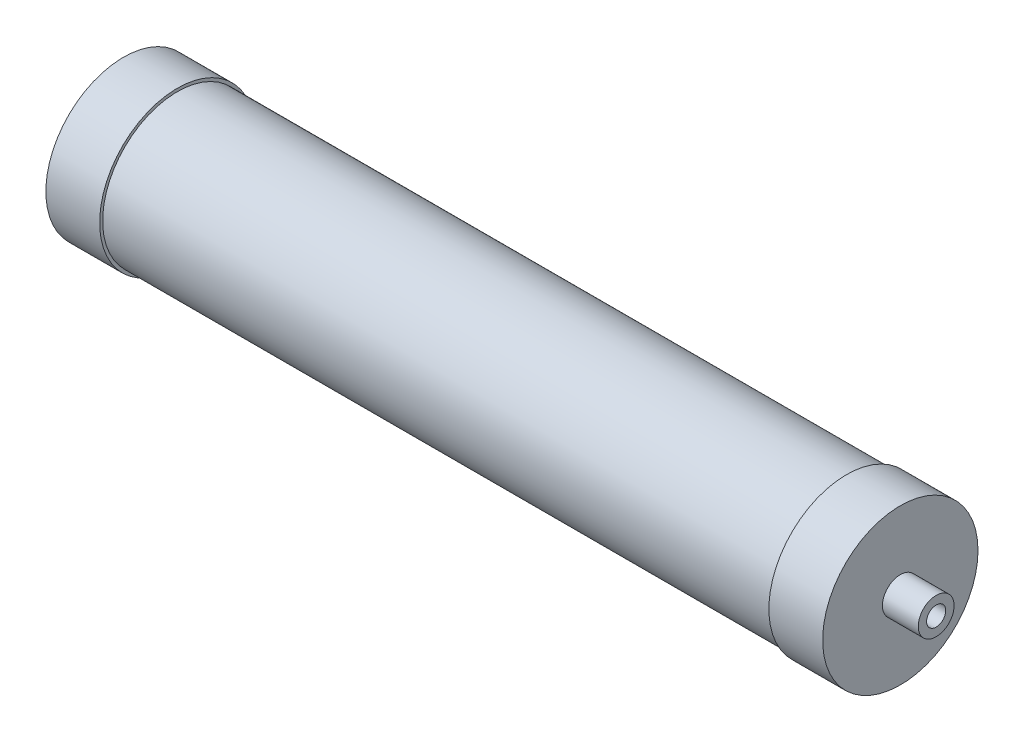
ISO-10303-21;
HEADER;
FILE_DESCRIPTION(('STEP AP214'),'2;1');
FILE_NAME('part.step','',(''),(''),'','','');
FILE_SCHEMA(('AUTOMOTIVE_DESIGN { 1 0 10303 214 1 1 1 1 }'));
ENDSEC;
DATA;
#1=APPLICATION_CONTEXT('core data for automotive mechanical design processes');
#2=APPLICATION_PROTOCOL_DEFINITION('international standard','automotive_design',2000,#1);
#3=PRODUCT_CONTEXT('',#1,'mechanical');
#4=PRODUCT('Part','Part','',(#3));
#5=PRODUCT_RELATED_PRODUCT_CATEGORY('part','',(#4));
#6=PRODUCT_DEFINITION_FORMATION('','',#4);
#7=PRODUCT_DEFINITION_CONTEXT('part definition',#1,'design');
#8=PRODUCT_DEFINITION('design','',#6,#7);
#9=PRODUCT_DEFINITION_SHAPE('','',#8);
#10=(LENGTH_UNIT() NAMED_UNIT(*) SI_UNIT(.MILLI.,.METRE.));
#11=(NAMED_UNIT(*) PLANE_ANGLE_UNIT() SI_UNIT($,.RADIAN.));
#12=(NAMED_UNIT(*) SI_UNIT($,.STERADIAN.) SOLID_ANGLE_UNIT());
#13=UNCERTAINTY_MEASURE_WITH_UNIT(LENGTH_MEASURE(1.E-05),#10,'distance_accuracy_value','');
#14=(GEOMETRIC_REPRESENTATION_CONTEXT(3) GLOBAL_UNCERTAINTY_ASSIGNED_CONTEXT((#13)) GLOBAL_UNIT_ASSIGNED_CONTEXT((#10,
#11,#12)) REPRESENTATION_CONTEXT('',''));
#15=CARTESIAN_POINT('',(0.,0.,0.));
#16=DIRECTION('',(0.,0.,1.));
#17=DIRECTION('',(1.,0.,0.));
#18=AXIS2_PLACEMENT_3D('',#15,#16,#17);
#19=CARTESIAN_POINT('',(130.,0.,0.));
#20=DIRECTION('',(-1.,0.,0.));
#21=DIRECTION('',(0.,0.,1.));
#22=AXIS2_PLACEMENT_3D('',#19,#20,#21);
#23=CYLINDRICAL_SURFACE('',#22,25.);
#24=CARTESIAN_POINT('',(-112.,0.,0.));
#25=DIRECTION('',(1.,0.,0.));
#26=DIRECTION('',(0.,0.,-1.));
#27=AXIS2_PLACEMENT_3D('',#24,#25,#26);
#28=CIRCLE('',#27,25.);
#29=CARTESIAN_POINT('',(-112.,0.,-25.));
#30=VERTEX_POINT('',#29);
#31=EDGE_CURVE('E58',#30,#30,#28,.T.);
#32=ORIENTED_EDGE('',*,*,#31,.T.);
#33=EDGE_LOOP('',(#32));
#34=FACE_BOUND('',#33,.T.);
#35=CARTESIAN_POINT('',(112.,0.,0.));
#36=DIRECTION('',(1.,0.,0.));
#37=DIRECTION('',(0.,0.,-1.));
#38=AXIS2_PLACEMENT_3D('',#35,#36,#37);
#39=CIRCLE('',#38,25.);
#40=CARTESIAN_POINT('',(112.,0.,-25.));
#41=VERTEX_POINT('',#40);
#42=EDGE_CURVE('E49',#41,#41,#39,.T.);
#43=ORIENTED_EDGE('',*,*,#42,.F.);
#44=EDGE_LOOP('',(#43));
#45=FACE_BOUND('',#44,.T.);
#46=ADVANCED_FACE('F50',(#34,#45),#23,.T.);
#47=CARTESIAN_POINT('',(-112.,0.,0.));
#48=DIRECTION('',(-1.,0.,0.));
#49=DIRECTION('',(0.,0.,1.));
#50=AXIS2_PLACEMENT_3D('',#47,#48,#49);
#51=CYLINDRICAL_SURFACE('',#50,26.);
#52=CARTESIAN_POINT('',(-112.,0.,0.));
#53=DIRECTION('',(1.,0.,0.));
#54=DIRECTION('',(0.,0.,-1.));
#55=AXIS2_PLACEMENT_3D('',#52,#53,#54);
#56=CIRCLE('',#55,26.);
#57=CARTESIAN_POINT('',(-112.,0.,-26.));
#58=VERTEX_POINT('',#57);
#59=EDGE_CURVE('E89',#58,#58,#56,.T.);
#60=ORIENTED_EDGE('',*,*,#59,.F.);
#61=EDGE_LOOP('',(#60));
#62=FACE_BOUND('',#61,.T.);
#63=CARTESIAN_POINT('',(-130.,0.,0.));
#64=DIRECTION('',(1.,0.,0.));
#65=DIRECTION('',(0.,0.,-1.));
#66=AXIS2_PLACEMENT_3D('',#63,#64,#65);
#67=CIRCLE('',#66,26.);
#68=CARTESIAN_POINT('',(-130.,0.,-26.));
#69=VERTEX_POINT('',#68);
#70=EDGE_CURVE('E88',#69,#69,#67,.T.);
#71=ORIENTED_EDGE('',*,*,#70,.T.);
#72=EDGE_LOOP('',(#71));
#73=FACE_BOUND('',#72,.T.);
#74=ADVANCED_FACE('F106',(#62,#73),#51,.T.);
#75=CARTESIAN_POINT('',(-112.,0.,0.));
#76=DIRECTION('',(1.,0.,0.));
#77=DIRECTION('',(0.,0.,-1.));
#78=AXIS2_PLACEMENT_3D('',#75,#76,#77);
#79=PLANE('',#78);
#80=ORIENTED_EDGE('',*,*,#31,.F.);
#81=EDGE_LOOP('',(#80));
#82=FACE_BOUND('',#81,.T.);
#83=ORIENTED_EDGE('',*,*,#59,.T.);
#84=EDGE_LOOP('',(#83));
#85=FACE_BOUND('',#84,.T.);
#86=ADVANCED_FACE('F105',(#82,#85),#79,.T.);
#87=CARTESIAN_POINT('',(-130.,0.,0.));
#88=DIRECTION('',(1.,0.,0.));
#89=DIRECTION('',(0.,0.,-1.));
#90=AXIS2_PLACEMENT_3D('',#87,#88,#89);
#91=PLANE('',#90);
#92=CARTESIAN_POINT('',(-130.,0.,0.));
#93=DIRECTION('',(1.,0.,0.));
#94=DIRECTION('',(0.,0.,-1.));
#95=AXIS2_PLACEMENT_3D('',#92,#93,#94);
#96=CIRCLE('',#95,6.);
#97=CARTESIAN_POINT('',(-130.,0.,-6.));
#98=VERTEX_POINT('',#97);
#99=EDGE_CURVE('E74',#98,#98,#96,.T.);
#100=ORIENTED_EDGE('',*,*,#99,.T.);
#101=EDGE_LOOP('',(#100));
#102=FACE_BOUND('',#101,.T.);
#103=ORIENTED_EDGE('',*,*,#70,.F.);
#104=EDGE_LOOP('',(#103));
#105=FACE_BOUND('',#104,.T.);
#106=ADVANCED_FACE('F104',(#102,#105),#91,.F.);
#107=CARTESIAN_POINT('',(130.,0.,0.));
#108=DIRECTION('',(-1.,0.,0.));
#109=DIRECTION('',(0.,0.,1.));
#110=AXIS2_PLACEMENT_3D('',#107,#108,#109);
#111=CYLINDRICAL_SURFACE('',#110,26.);
#112=CARTESIAN_POINT('',(130.,0.,0.));
#113=DIRECTION('',(1.,0.,0.));
#114=DIRECTION('',(0.,0.,-1.));
#115=AXIS2_PLACEMENT_3D('',#112,#113,#114);
#116=CIRCLE('',#115,26.);
#117=CARTESIAN_POINT('',(130.,0.,-26.));
#118=VERTEX_POINT('',#117);
#119=EDGE_CURVE('E85',#118,#118,#116,.T.);
#120=ORIENTED_EDGE('',*,*,#119,.F.);
#121=EDGE_LOOP('',(#120));
#122=FACE_BOUND('',#121,.T.);
#123=CARTESIAN_POINT('',(112.,0.,0.));
#124=DIRECTION('',(1.,0.,0.));
#125=DIRECTION('',(0.,0.,-1.));
#126=AXIS2_PLACEMENT_3D('',#123,#124,#125);
#127=CIRCLE('',#126,26.);
#128=CARTESIAN_POINT('',(112.,0.,-26.));
#129=VERTEX_POINT('',#128);
#130=EDGE_CURVE('E79',#129,#129,#127,.T.);
#131=ORIENTED_EDGE('',*,*,#130,.T.);
#132=EDGE_LOOP('',(#131));
#133=FACE_BOUND('',#132,.T.);
#134=ADVANCED_FACE('F116',(#122,#133),#111,.T.);
#135=CARTESIAN_POINT('',(112.,0.,0.));
#136=DIRECTION('',(1.,0.,0.));
#137=DIRECTION('',(0.,0.,-1.));
#138=AXIS2_PLACEMENT_3D('',#135,#136,#137);
#139=PLANE('',#138);
#140=ORIENTED_EDGE('',*,*,#42,.T.);
#141=EDGE_LOOP('',(#140));
#142=FACE_BOUND('',#141,.T.);
#143=ORIENTED_EDGE('',*,*,#130,.F.);
#144=EDGE_LOOP('',(#143));
#145=FACE_BOUND('',#144,.T.);
#146=ADVANCED_FACE('F123',(#142,#145),#139,.F.);
#147=CARTESIAN_POINT('',(130.,0.,0.));
#148=DIRECTION('',(1.,0.,0.));
#149=DIRECTION('',(0.,0.,-1.));
#150=AXIS2_PLACEMENT_3D('',#147,#148,#149);
#151=PLANE('',#150);
#152=CARTESIAN_POINT('',(130.,0.,0.));
#153=DIRECTION('',(1.,0.,0.));
#154=DIRECTION('',(0.,0.,-1.));
#155=AXIS2_PLACEMENT_3D('',#152,#153,#154);
#156=CIRCLE('',#155,6.);
#157=CARTESIAN_POINT('',(130.,0.,-6.));
#158=VERTEX_POINT('',#157);
#159=EDGE_CURVE('E10',#158,#158,#156,.T.);
#160=ORIENTED_EDGE('',*,*,#159,.F.);
#161=EDGE_LOOP('',(#160));
#162=FACE_BOUND('',#161,.T.);
#163=ORIENTED_EDGE('',*,*,#119,.T.);
#164=EDGE_LOOP('',(#163));
#165=FACE_BOUND('',#164,.T.);
#166=ADVANCED_FACE('F147',(#162,#165),#151,.T.);
#167=CARTESIAN_POINT('',(-130.,0.,0.));
#168=DIRECTION('',(-1.,0.,0.));
#169=DIRECTION('',(0.,0.,1.));
#170=AXIS2_PLACEMENT_3D('',#167,#168,#169);
#171=CYLINDRICAL_SURFACE('',#170,6.);
#172=ORIENTED_EDGE('',*,*,#99,.F.);
#173=EDGE_LOOP('',(#172));
#174=FACE_BOUND('',#173,.T.);
#175=CARTESIAN_POINT('',(-142.,0.,0.));
#176=DIRECTION('',(1.,0.,0.));
#177=DIRECTION('',(0.,0.,-1.));
#178=AXIS2_PLACEMENT_3D('',#175,#176,#177);
#179=CIRCLE('',#178,6.);
#180=CARTESIAN_POINT('',(-142.,0.,-6.));
#181=VERTEX_POINT('',#180);
#182=EDGE_CURVE('E69',#181,#181,#179,.T.);
#183=ORIENTED_EDGE('',*,*,#182,.T.);
#184=EDGE_LOOP('',(#183));
#185=FACE_BOUND('',#184,.T.);
#186=ADVANCED_FACE('F189',(#174,#185),#171,.T.);
#187=CARTESIAN_POINT('',(-142.,0.,0.));
#188=DIRECTION('',(1.,0.,0.));
#189=DIRECTION('',(0.,0.,-1.));
#190=AXIS2_PLACEMENT_3D('',#187,#188,#189);
#191=PLANE('',#190);
#192=CARTESIAN_POINT('',(-142.,0.,0.));
#193=DIRECTION('',(1.,0.,0.));
#194=DIRECTION('',(0.,0.,-1.));
#195=AXIS2_PLACEMENT_3D('',#192,#193,#194);
#196=CIRCLE('',#195,3.2);
#197=CARTESIAN_POINT('',(-142.,0.,-3.2));
#198=VERTEX_POINT('',#197);
#199=EDGE_CURVE('E66',#198,#198,#196,.T.);
#200=ORIENTED_EDGE('',*,*,#199,.T.);
#201=EDGE_LOOP('',(#200));
#202=FACE_BOUND('',#201,.T.);
#203=ORIENTED_EDGE('',*,*,#182,.F.);
#204=EDGE_LOOP('',(#203));
#205=FACE_BOUND('',#204,.T.);
#206=ADVANCED_FACE('F203',(#202,#205),#191,.F.);
#207=CARTESIAN_POINT('',(-132.,0.,0.));
#208=DIRECTION('',(-1.,0.,0.));
#209=DIRECTION('',(0.,0.,1.));
#210=AXIS2_PLACEMENT_3D('',#207,#208,#209);
#211=CYLINDRICAL_SURFACE('',#210,3.2);
#212=CARTESIAN_POINT('',(-132.,0.,0.));
#213=DIRECTION('',(1.,0.,0.));
#214=DIRECTION('',(0.,0.,-1.));
#215=AXIS2_PLACEMENT_3D('',#212,#213,#214);
#216=CIRCLE('',#215,3.2);
#217=CARTESIAN_POINT('',(-132.,0.,-3.2));
#218=VERTEX_POINT('',#217);
#219=EDGE_CURVE('E65',#218,#218,#216,.T.);
#220=ORIENTED_EDGE('',*,*,#219,.T.);
#221=EDGE_LOOP('',(#220));
#222=FACE_BOUND('',#221,.T.);
#223=ORIENTED_EDGE('',*,*,#199,.F.);
#224=EDGE_LOOP('',(#223));
#225=FACE_BOUND('',#224,.T.);
#226=ADVANCED_FACE('F211',(#222,#225),#211,.F.);
#227=CARTESIAN_POINT('',(-132.,0.,0.));
#228=DIRECTION('',(1.,0.,0.));
#229=DIRECTION('',(0.,0.,-1.));
#230=AXIS2_PLACEMENT_3D('',#227,#228,#229);
#231=PLANE('',#230);
#232=ORIENTED_EDGE('',*,*,#219,.F.);
#233=EDGE_LOOP('',(#232));
#234=FACE_BOUND('',#233,.T.);
#235=ADVANCED_FACE('F222',(#234),#231,.F.);
#236=CARTESIAN_POINT('',(142.,0.,0.));
#237=DIRECTION('',(-1.,0.,0.));
#238=DIRECTION('',(0.,0.,1.));
#239=AXIS2_PLACEMENT_3D('',#236,#237,#238);
#240=CYLINDRICAL_SURFACE('',#239,6.);
#241=CARTESIAN_POINT('',(142.,0.,0.));
#242=DIRECTION('',(1.,0.,0.));
#243=DIRECTION('',(0.,0.,-1.));
#244=AXIS2_PLACEMENT_3D('',#241,#242,#243);
#245=CIRCLE('',#244,6.);
#246=CARTESIAN_POINT('',(142.,0.,-6.));
#247=VERTEX_POINT('',#246);
#248=EDGE_CURVE('E64',#247,#247,#245,.T.);
#249=ORIENTED_EDGE('',*,*,#248,.F.);
#250=EDGE_LOOP('',(#249));
#251=FACE_BOUND('',#250,.T.);
#252=ORIENTED_EDGE('',*,*,#159,.T.);
#253=EDGE_LOOP('',(#252));
#254=FACE_BOUND('',#253,.T.);
#255=ADVANCED_FACE('F230',(#251,#254),#240,.T.);
#256=CARTESIAN_POINT('',(142.,0.,0.));
#257=DIRECTION('',(1.,0.,0.));
#258=DIRECTION('',(0.,0.,-1.));
#259=AXIS2_PLACEMENT_3D('',#256,#257,#258);
#260=PLANE('',#259);
#261=CARTESIAN_POINT('',(142.,0.,0.));
#262=DIRECTION('',(1.,0.,0.));
#263=DIRECTION('',(0.,0.,-1.));
#264=AXIS2_PLACEMENT_3D('',#261,#262,#263);
#265=CIRCLE('',#264,3.2);
#266=CARTESIAN_POINT('',(142.,0.,-3.2));
#267=VERTEX_POINT('',#266);
#268=EDGE_CURVE('E277',#267,#267,#265,.T.);
#269=ORIENTED_EDGE('',*,*,#268,.F.);
#270=EDGE_LOOP('',(#269));
#271=FACE_BOUND('',#270,.T.);
#272=ORIENTED_EDGE('',*,*,#248,.T.);
#273=EDGE_LOOP('',(#272));
#274=FACE_BOUND('',#273,.T.);
#275=ADVANCED_FACE('F239',(#271,#274),#260,.T.);
#276=CARTESIAN_POINT('',(132.,0.,0.));
#277=DIRECTION('',(1.,0.,0.));
#278=DIRECTION('',(0.,0.,-1.));
#279=AXIS2_PLACEMENT_3D('',#276,#277,#278);
#280=CYLINDRICAL_SURFACE('',#279,3.2);
#281=CARTESIAN_POINT('',(132.,0.,0.));
#282=DIRECTION('',(1.,0.,0.));
#283=DIRECTION('',(0.,0.,-1.));
#284=AXIS2_PLACEMENT_3D('',#281,#282,#283);
#285=CIRCLE('',#284,3.2);
#286=CARTESIAN_POINT('',(132.,0.,-3.2));
#287=VERTEX_POINT('',#286);
#288=EDGE_CURVE('E273',#287,#287,#285,.T.);
#289=ORIENTED_EDGE('',*,*,#288,.F.);
#290=EDGE_LOOP('',(#289));
#291=FACE_BOUND('',#290,.T.);
#292=ORIENTED_EDGE('',*,*,#268,.T.);
#293=EDGE_LOOP('',(#292));
#294=FACE_BOUND('',#293,.T.);
#295=ADVANCED_FACE('F249',(#291,#294),#280,.F.);
#296=CARTESIAN_POINT('',(132.,0.,0.));
#297=DIRECTION('',(1.,0.,0.));
#298=DIRECTION('',(0.,0.,-1.));
#299=AXIS2_PLACEMENT_3D('',#296,#297,#298);
#300=PLANE('',#299);
#301=ORIENTED_EDGE('',*,*,#288,.T.);
#302=EDGE_LOOP('',(#301));
#303=FACE_BOUND('',#302,.T.);
#304=ADVANCED_FACE('F259',(#303),#300,.T.);
#305=CLOSED_SHELL('',(#46,#74,#86,#106,#134,#146,#166,#186,#206,#226,#235,#255,#275,#295,#304));
#306=MANIFOLD_SOLID_BREP('B2',#305);
#307=ADVANCED_BREP_SHAPE_REPRESENTATION('',(#18,#306),#14);
#308=SHAPE_DEFINITION_REPRESENTATION(#9,#307);
ENDSEC;
END-ISO-10303-21;
